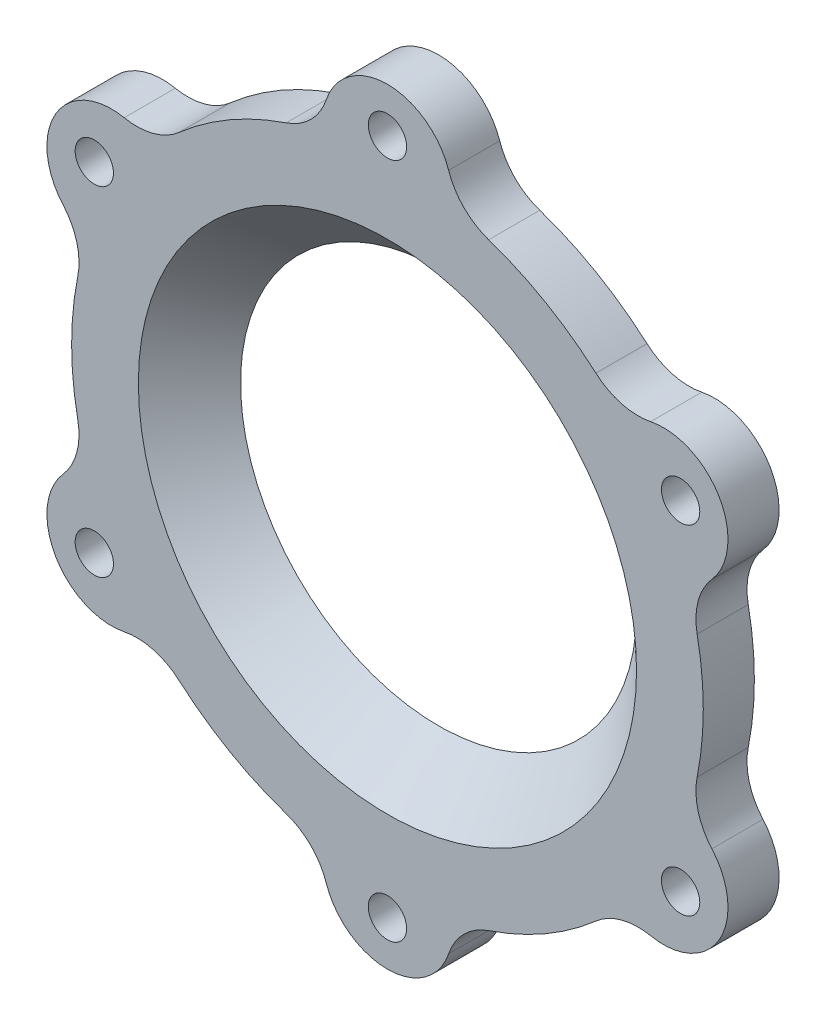
ISO-10303-21;
HEADER;
FILE_DESCRIPTION(('STEP AP214'),'2;1');
FILE_NAME('part.step','',(''),(''),'','','');
FILE_SCHEMA(('AUTOMOTIVE_DESIGN { 1 0 10303 214 1 1 1 1 }'));
ENDSEC;
DATA;
#1=APPLICATION_CONTEXT('core data for automotive mechanical design processes');
#2=APPLICATION_PROTOCOL_DEFINITION('international standard','automotive_design',2000,#1);
#3=PRODUCT_CONTEXT('',#1,'mechanical');
#4=PRODUCT('Part','Part','',(#3));
#5=PRODUCT_RELATED_PRODUCT_CATEGORY('part','',(#4));
#6=PRODUCT_DEFINITION_FORMATION('','',#4);
#7=PRODUCT_DEFINITION_CONTEXT('part definition',#1,'design');
#8=PRODUCT_DEFINITION('design','',#6,#7);
#9=PRODUCT_DEFINITION_SHAPE('','',#8);
#10=(LENGTH_UNIT() NAMED_UNIT(*) SI_UNIT(.MILLI.,.METRE.));
#11=(NAMED_UNIT(*) PLANE_ANGLE_UNIT() SI_UNIT($,.RADIAN.));
#12=(NAMED_UNIT(*) SI_UNIT($,.STERADIAN.) SOLID_ANGLE_UNIT());
#13=UNCERTAINTY_MEASURE_WITH_UNIT(LENGTH_MEASURE(1.E-05),#10,'distance_accuracy_value','');
#14=(GEOMETRIC_REPRESENTATION_CONTEXT(3) GLOBAL_UNCERTAINTY_ASSIGNED_CONTEXT((#13)) GLOBAL_UNIT_ASSIGNED_CONTEXT((#10,
#11,#12)) REPRESENTATION_CONTEXT('',''));
#15=CARTESIAN_POINT('',(0.,0.,0.));
#16=DIRECTION('',(0.,0.,1.));
#17=DIRECTION('',(1.,0.,0.));
#18=AXIS2_PLACEMENT_3D('',#15,#16,#17);
#19=CARTESIAN_POINT('',(0.,49.8932666526099,8.));
#20=DIRECTION('',(0.,0.,-1.));
#21=DIRECTION('',(-1.,0.,0.));
#22=AXIS2_PLACEMENT_3D('',#19,#20,#21);
#23=CYLINDRICAL_SURFACE('',#22,10.1067333473901);
#24=CARTESIAN_POINT('',(0.,49.8932666526099,0.));
#25=DIRECTION('',(0.,0.,1.));
#26=DIRECTION('',(1.,0.,0.));
#27=AXIS2_PLACEMENT_3D('',#24,#25,#26);
#28=CIRCLE('',#27,10.1067333473901);
#29=CARTESIAN_POINT('',(-9.57760471103616,53.120579304707,0.));
#30=VERTEX_POINT('',#29);
#31=CARTESIAN_POINT('',(9.57760471103616,53.120579304707,0.));
#32=VERTEX_POINT('',#31);
#33=EDGE_CURVE('E324',#30,#32,#28,.F.);
#34=ORIENTED_EDGE('',*,*,#33,.F.);
#35=DIRECTION('',(0.,0.,-1.));
#36=VECTOR('',#35,1.);
#37=CARTESIAN_POINT('',(-9.57760471103616,53.120579304707,8.));
#38=LINE('',#37,#36);
#39=CARTESIAN_POINT('',(-9.57760471103616,53.120579304707,8.));
#40=VERTEX_POINT('',#39);
#41=EDGE_CURVE('E58',#40,#30,#38,.T.);
#42=ORIENTED_EDGE('',*,*,#41,.F.);
#43=CARTESIAN_POINT('',(0.,49.8932666526099,8.));
#44=DIRECTION('',(0.,0.,1.));
#45=DIRECTION('',(1.,0.,0.));
#46=AXIS2_PLACEMENT_3D('',#43,#44,#45);
#47=CIRCLE('',#46,10.1067333473901);
#48=CARTESIAN_POINT('',(9.57760471103616,53.120579304707,8.));
#49=VERTEX_POINT('',#48);
#50=EDGE_CURVE('E478',#40,#49,#47,.F.);
#51=ORIENTED_EDGE('',*,*,#50,.T.);
#52=DIRECTION('',(0.,0.,-1.));
#53=VECTOR('',#52,1.);
#54=CARTESIAN_POINT('',(9.57760471103616,53.120579304707,8.));
#55=LINE('',#54,#53);
#56=EDGE_CURVE('E66',#49,#32,#55,.T.);
#57=ORIENTED_EDGE('',*,*,#56,.T.);
#58=EDGE_LOOP('',(#34,#42,#51,#57));
#59=FACE_BOUND('',#58,.T.);
#60=ADVANCED_FACE('F47',(#59),#23,.T.);
#61=CARTESIAN_POINT('',(-19.0540639999412,56.3138095415871,8.));
#62=DIRECTION('',(0.,0.,-1.));
#63=DIRECTION('',(-1.,0.,0.));
#64=AXIS2_PLACEMENT_3D('',#61,#62,#63);
#65=CYLINDRICAL_SURFACE('',#64,9.99999999999999);
#66=CARTESIAN_POINT('',(-19.0540639999412,56.3138095415871,0.));
#67=DIRECTION('',(0.,0.,1.));
#68=DIRECTION('',(1.,0.,0.));
#69=AXIS2_PLACEMENT_3D('',#66,#67,#68);
#70=CIRCLE('',#69,9.99999999999999);
#71=CARTESIAN_POINT('',(-15.8490069772429,46.8413436809333,0.));
#72=VERTEX_POINT('',#71);
#73=EDGE_CURVE('E317',#30,#72,#70,.F.);
#74=ORIENTED_EDGE('',*,*,#73,.T.);
#75=DIRECTION('',(0.,0.,-1.));
#76=VECTOR('',#75,1.);
#77=CARTESIAN_POINT('',(-15.8490069772429,46.8413436809333,8.));
#78=LINE('',#77,#76);
#79=CARTESIAN_POINT('',(-15.8490069772429,46.8413436809333,8.));
#80=VERTEX_POINT('',#79);
#81=EDGE_CURVE('E308',#80,#72,#78,.T.);
#82=ORIENTED_EDGE('',*,*,#81,.F.);
#83=CARTESIAN_POINT('',(-19.0540639999412,56.3138095415871,8.));
#84=DIRECTION('',(0.,0.,1.));
#85=DIRECTION('',(1.,0.,0.));
#86=AXIS2_PLACEMENT_3D('',#83,#84,#85);
#87=CIRCLE('',#86,9.99999999999999);
#88=EDGE_CURVE('E319',#40,#80,#87,.F.);
#89=ORIENTED_EDGE('',*,*,#88,.F.);
#90=ORIENTED_EDGE('',*,*,#41,.T.);
#91=EDGE_LOOP('',(#74,#82,#89,#90));
#92=FACE_BOUND('',#91,.T.);
#93=ADVANCED_FACE('F315',(#92),#65,.F.);
#94=CARTESIAN_POINT('',(0.,0.,8.));
#95=DIRECTION('',(0.,0.,-1.));
#96=DIRECTION('',(-1.,0.,0.));
#97=AXIS2_PLACEMENT_3D('',#94,#95,#96);
#98=CYLINDRICAL_SURFACE('',#97,49.45);
#99=CARTESIAN_POINT('',(0.,0.,0.));
#100=DIRECTION('',(0.,0.,1.));
#101=DIRECTION('',(1.,0.,0.));
#102=AXIS2_PLACEMENT_3D('',#99,#100,#101);
#103=CIRCLE('',#102,49.45);
#104=CARTESIAN_POINT('',(-32.6412900864638,37.1463145075139,0.));
#105=VERTEX_POINT('',#104);
#106=EDGE_CURVE('E327',#72,#105,#103,.T.);
#107=ORIENTED_EDGE('',*,*,#106,.T.);
#108=DIRECTION('',(0.,0.,-1.));
#109=VECTOR('',#108,1.);
#110=CARTESIAN_POINT('',(-32.6412900864638,37.1463145075139,8.));
#111=LINE('',#110,#109);
#112=CARTESIAN_POINT('',(-32.6412900864638,37.1463145075139,8.));
#113=VERTEX_POINT('',#112);
#114=EDGE_CURVE('E305',#113,#105,#111,.T.);
#115=ORIENTED_EDGE('',*,*,#114,.F.);
#116=CARTESIAN_POINT('',(0.,0.,8.));
#117=DIRECTION('',(0.,0.,1.));
#118=DIRECTION('',(1.,0.,0.));
#119=AXIS2_PLACEMENT_3D('',#116,#117,#118);
#120=CIRCLE('',#119,49.45);
#121=EDGE_CURVE('E226',#80,#113,#120,.T.);
#122=ORIENTED_EDGE('',*,*,#121,.F.);
#123=ORIENTED_EDGE('',*,*,#81,.T.);
#124=EDGE_LOOP('',(#107,#115,#122,#123));
#125=FACE_BOUND('',#124,.T.);
#126=ADVANCED_FACE('F457',(#125),#98,.T.);
#127=CARTESIAN_POINT('',(-39.2421576469201,44.6582082400733,8.));
#128=DIRECTION('',(0.,0.,-1.));
#129=DIRECTION('',(-1.,0.,0.));
#130=AXIS2_PLACEMENT_3D('',#127,#128,#129);
#131=CYLINDRICAL_SURFACE('',#130,9.99999999999999);
#132=CARTESIAN_POINT('',(-39.2421576469201,44.6582082400733,0.));
#133=DIRECTION('',(0.,0.,1.));
#134=DIRECTION('',(1.,0.,0.));
#135=AXIS2_PLACEMENT_3D('',#132,#133,#134);
#136=CIRCLE('',#135,9.99999999999999);
#137=CARTESIAN_POINT('',(-41.2149687861018,34.8547386395124,0.));
#138=VERTEX_POINT('',#137);
#139=EDGE_CURVE('E341',#138,#105,#136,.T.);
#140=ORIENTED_EDGE('',*,*,#139,.F.);
#141=DIRECTION('',(0.,0.,-1.));
#142=VECTOR('',#141,1.);
#143=CARTESIAN_POINT('',(-41.2149687861018,34.8547386395124,8.));
#144=LINE('',#143,#142);
#145=CARTESIAN_POINT('',(-41.2149687861018,34.8547386395124,8.));
#146=VERTEX_POINT('',#145);
#147=EDGE_CURVE('E302',#146,#138,#144,.T.);
#148=ORIENTED_EDGE('',*,*,#147,.F.);
#149=CARTESIAN_POINT('',(-39.2421576469201,44.6582082400733,8.));
#150=DIRECTION('',(0.,0.,1.));
#151=DIRECTION('',(1.,0.,0.));
#152=AXIS2_PLACEMENT_3D('',#149,#150,#151);
#153=CIRCLE('',#152,9.99999999999999);
#154=EDGE_CURVE('E486',#146,#113,#153,.T.);
#155=ORIENTED_EDGE('',*,*,#154,.T.);
#156=ORIENTED_EDGE('',*,*,#114,.T.);
#157=EDGE_LOOP('',(#140,#148,#155,#156));
#158=FACE_BOUND('',#157,.T.);
#159=ADVANCED_FACE('F645',(#158),#131,.F.);
#160=CARTESIAN_POINT('',(-43.2088363989489,24.946633326301,8.));
#161=DIRECTION('',(0.,0.,-1.));
#162=DIRECTION('',(-1.,0.,0.));
#163=AXIS2_PLACEMENT_3D('',#160,#161,#162);
#164=CYLINDRICAL_SURFACE('',#163,10.1067333473901);
#165=CARTESIAN_POINT('',(-43.2088363989489,24.946633326301,0.));
#166=DIRECTION('',(0.,0.,1.));
#167=DIRECTION('',(1.,0.,0.));
#168=AXIS2_PLACEMENT_3D('',#165,#166,#167);
#169=CIRCLE('',#168,10.1067333473901);
#170=CARTESIAN_POINT('',(-50.792573497138,18.2658406651867,0.));
#171=VERTEX_POINT('',#170);
#172=EDGE_CURVE('E346',#171,#138,#169,.F.);
#173=ORIENTED_EDGE('',*,*,#172,.F.);
#174=DIRECTION('',(0.,0.,-1.));
#175=VECTOR('',#174,1.);
#176=CARTESIAN_POINT('',(-50.792573497138,18.2658406651867,8.));
#177=LINE('',#176,#175);
#178=CARTESIAN_POINT('',(-50.792573497138,18.2658406651867,8.));
#179=VERTEX_POINT('',#178);
#180=EDGE_CURVE('E299',#179,#171,#177,.T.);
#181=ORIENTED_EDGE('',*,*,#180,.F.);
#182=CARTESIAN_POINT('',(-43.2088363989489,24.946633326301,8.));
#183=DIRECTION('',(0.,0.,1.));
#184=DIRECTION('',(1.,0.,0.));
#185=AXIS2_PLACEMENT_3D('',#182,#183,#184);
#186=CIRCLE('',#185,10.1067333473901);
#187=EDGE_CURVE('E491',#179,#146,#186,.F.);
#188=ORIENTED_EDGE('',*,*,#187,.T.);
#189=ORIENTED_EDGE('',*,*,#147,.T.);
#190=EDGE_LOOP('',(#173,#181,#188,#189));
#191=FACE_BOUND('',#190,.T.);
#192=ADVANCED_FACE('F642',(#191),#164,.T.);
#193=CARTESIAN_POINT('',(-58.2962216468613,11.655601301506,8.));
#194=DIRECTION('',(0.,0.,-1.));
#195=DIRECTION('',(-1.,0.,0.));
#196=AXIS2_PLACEMENT_3D('',#193,#194,#195);
#197=CYLINDRICAL_SURFACE('',#196,9.99999999999999);
#198=CARTESIAN_POINT('',(-58.2962216468613,11.655601301506,0.));
#199=DIRECTION('',(0.,0.,1.));
#200=DIRECTION('',(1.,0.,0.));
#201=AXIS2_PLACEMENT_3D('',#198,#199,#200);
#202=CIRCLE('',#201,9.99999999999999);
#203=CARTESIAN_POINT('',(-48.4902970637067,9.69502917341443,0.));
#204=VERTEX_POINT('',#203);
#205=EDGE_CURVE('E350',#171,#204,#202,.F.);
#206=ORIENTED_EDGE('',*,*,#205,.T.);
#207=DIRECTION('',(0.,0.,-1.));
#208=VECTOR('',#207,1.);
#209=CARTESIAN_POINT('',(-48.4902970637067,9.69502917341443,8.));
#210=LINE('',#209,#208);
#211=CARTESIAN_POINT('',(-48.4902970637067,9.69502917341443,8.));
#212=VERTEX_POINT('',#211);
#213=EDGE_CURVE('E295',#212,#204,#210,.T.);
#214=ORIENTED_EDGE('',*,*,#213,.F.);
#215=CARTESIAN_POINT('',(-58.2962216468613,11.655601301506,8.));
#216=DIRECTION('',(0.,0.,1.));
#217=DIRECTION('',(1.,0.,0.));
#218=AXIS2_PLACEMENT_3D('',#215,#216,#217);
#219=CIRCLE('',#218,9.99999999999999);
#220=EDGE_CURVE('E495',#179,#212,#219,.F.);
#221=ORIENTED_EDGE('',*,*,#220,.F.);
#222=ORIENTED_EDGE('',*,*,#180,.T.);
#223=EDGE_LOOP('',(#206,#214,#221,#222));
#224=FACE_BOUND('',#223,.T.);
#225=ADVANCED_FACE('F639',(#224),#197,.F.);
#226=CARTESIAN_POINT('',(-48.4902970637042,-9.69502917342115,0.));
#227=VERTEX_POINT('',#226);
#228=EDGE_CURVE('E343',#204,#227,#103,.T.);
#229=ORIENTED_EDGE('',*,*,#228,.T.);
#230=DIRECTION('',(0.,0.,-1.));
#231=VECTOR('',#230,1.);
#232=CARTESIAN_POINT('',(-48.4902970637042,-9.69502917342115,8.));
#233=LINE('',#232,#231);
#234=CARTESIAN_POINT('',(-48.4902970637042,-9.69502917342115,8.));
#235=VERTEX_POINT('',#234);
#236=EDGE_CURVE('E292',#235,#227,#233,.T.);
#237=ORIENTED_EDGE('',*,*,#236,.F.);
#238=EDGE_CURVE('E487',#212,#235,#120,.T.);
#239=ORIENTED_EDGE('',*,*,#238,.F.);
#240=ORIENTED_EDGE('',*,*,#213,.T.);
#241=EDGE_LOOP('',(#229,#237,#239,#240));
#242=FACE_BOUND('',#241,.T.);
#243=ADVANCED_FACE('F637',(#242),#98,.T.);
#244=CARTESIAN_POINT('',(-58.2962216468568,-11.6556013015138,8.));
#245=DIRECTION('',(0.,0.,-1.));
#246=DIRECTION('',(-1.,0.,0.));
#247=AXIS2_PLACEMENT_3D('',#244,#245,#246);
#248=CYLINDRICAL_SURFACE('',#247,10.);
#249=CARTESIAN_POINT('',(-58.2962216468568,-11.6556013015138,0.));
#250=DIRECTION('',(0.,0.,1.));
#251=DIRECTION('',(1.,0.,0.));
#252=AXIS2_PLACEMENT_3D('',#249,#250,#251);
#253=CIRCLE('',#252,10.);
#254=CARTESIAN_POINT('',(-50.7925734971335,-18.2658406651945,0.));
#255=VERTEX_POINT('',#254);
#256=EDGE_CURVE('E354',#255,#227,#253,.T.);
#257=ORIENTED_EDGE('',*,*,#256,.F.);
#258=DIRECTION('',(0.,0.,-1.));
#259=VECTOR('',#258,1.);
#260=CARTESIAN_POINT('',(-50.7925734971335,-18.2658406651945,8.));
#261=LINE('',#260,#259);
#262=CARTESIAN_POINT('',(-50.7925734971335,-18.2658406651945,8.));
#263=VERTEX_POINT('',#262);
#264=EDGE_CURVE('E289',#263,#255,#261,.T.);
#265=ORIENTED_EDGE('',*,*,#264,.F.);
#266=CARTESIAN_POINT('',(-58.2962216468568,-11.6556013015138,8.));
#267=DIRECTION('',(0.,0.,1.));
#268=DIRECTION('',(1.,0.,0.));
#269=AXIS2_PLACEMENT_3D('',#266,#267,#268);
#270=CIRCLE('',#269,10.);
#271=EDGE_CURVE('E499',#263,#235,#270,.T.);
#272=ORIENTED_EDGE('',*,*,#271,.T.);
#273=ORIENTED_EDGE('',*,*,#236,.T.);
#274=EDGE_LOOP('',(#257,#265,#272,#273));
#275=FACE_BOUND('',#274,.T.);
#276=ADVANCED_FACE('F633',(#275),#248,.F.);
#277=CARTESIAN_POINT('',(-43.2088363989444,-24.9466333263088,8.));
#278=DIRECTION('',(0.,0.,-1.));
#279=DIRECTION('',(-1.,0.,0.));
#280=AXIS2_PLACEMENT_3D('',#277,#278,#279);
#281=CYLINDRICAL_SURFACE('',#280,10.1067333473901);
#282=CARTESIAN_POINT('',(-43.2088363989444,-24.9466333263088,0.));
#283=DIRECTION('',(0.,0.,1.));
#284=DIRECTION('',(1.,0.,0.));
#285=AXIS2_PLACEMENT_3D('',#282,#283,#284);
#286=CIRCLE('',#285,10.1067333473901);
#287=CARTESIAN_POINT('',(-41.2149687860973,-34.8547386395202,0.));
#288=VERTEX_POINT('',#287);
#289=EDGE_CURVE('E358',#288,#255,#286,.F.);
#290=ORIENTED_EDGE('',*,*,#289,.F.);
#291=DIRECTION('',(0.,0.,-1.));
#292=VECTOR('',#291,1.);
#293=CARTESIAN_POINT('',(-41.2149687860973,-34.8547386395202,8.));
#294=LINE('',#293,#292);
#295=CARTESIAN_POINT('',(-41.2149687860973,-34.8547386395202,8.));
#296=VERTEX_POINT('',#295);
#297=EDGE_CURVE('E286',#296,#288,#294,.T.);
#298=ORIENTED_EDGE('',*,*,#297,.F.);
#299=CARTESIAN_POINT('',(-43.2088363989444,-24.9466333263088,8.));
#300=DIRECTION('',(0.,0.,1.));
#301=DIRECTION('',(1.,0.,0.));
#302=AXIS2_PLACEMENT_3D('',#299,#300,#301);
#303=CIRCLE('',#302,10.1067333473901);
#304=EDGE_CURVE('E503',#296,#263,#303,.F.);
#305=ORIENTED_EDGE('',*,*,#304,.T.);
#306=ORIENTED_EDGE('',*,*,#264,.T.);
#307=EDGE_LOOP('',(#290,#298,#305,#306));
#308=FACE_BOUND('',#307,.T.);
#309=ADVANCED_FACE('F629',(#308),#281,.T.);
#310=CARTESIAN_POINT('',(-39.2421576469156,-44.658208240081,8.));
#311=DIRECTION('',(0.,0.,-1.));
#312=DIRECTION('',(-1.,0.,0.));
#313=AXIS2_PLACEMENT_3D('',#310,#311,#312);
#314=CYLINDRICAL_SURFACE('',#313,9.99999999999999);
#315=CARTESIAN_POINT('',(-39.2421576469156,-44.658208240081,0.));
#316=DIRECTION('',(0.,0.,1.));
#317=DIRECTION('',(1.,0.,0.));
#318=AXIS2_PLACEMENT_3D('',#315,#316,#317);
#319=CIRCLE('',#318,9.99999999999999);
#320=CARTESIAN_POINT('',(-32.6412900864593,-37.1463145075195,0.));
#321=VERTEX_POINT('',#320);
#322=EDGE_CURVE('E362',#288,#321,#319,.F.);
#323=ORIENTED_EDGE('',*,*,#322,.T.);
#324=DIRECTION('',(0.,0.,-1.));
#325=VECTOR('',#324,1.);
#326=CARTESIAN_POINT('',(-32.6412900864593,-37.1463145075195,8.));
#327=LINE('',#326,#325);
#328=CARTESIAN_POINT('',(-32.6412900864593,-37.1463145075195,8.));
#329=VERTEX_POINT('',#328);
#330=EDGE_CURVE('E282',#329,#321,#327,.T.);
#331=ORIENTED_EDGE('',*,*,#330,.F.);
#332=CARTESIAN_POINT('',(-39.2421576469156,-44.658208240081,8.));
#333=DIRECTION('',(0.,0.,1.));
#334=DIRECTION('',(1.,0.,0.));
#335=AXIS2_PLACEMENT_3D('',#332,#333,#334);
#336=CIRCLE('',#335,9.99999999999999);
#337=EDGE_CURVE('E507',#296,#329,#336,.F.);
#338=ORIENTED_EDGE('',*,*,#337,.F.);
#339=ORIENTED_EDGE('',*,*,#297,.T.);
#340=EDGE_LOOP('',(#323,#331,#338,#339));
#341=FACE_BOUND('',#340,.T.);
#342=ADVANCED_FACE('F626',(#341),#314,.F.);
#343=CARTESIAN_POINT('',(-15.8490069772359,-46.8413436809344,0.));
#344=VERTEX_POINT('',#343);
#345=EDGE_CURVE('E366',#321,#344,#103,.T.);
#346=ORIENTED_EDGE('',*,*,#345,.T.);
#347=DIRECTION('',(0.,0.,-1.));
#348=VECTOR('',#347,1.);
#349=CARTESIAN_POINT('',(-15.8490069772359,-46.8413436809344,8.));
#350=LINE('',#349,#348);
#351=CARTESIAN_POINT('',(-15.8490069772359,-46.8413436809344,8.));
#352=VERTEX_POINT('',#351);
#353=EDGE_CURVE('E279',#352,#344,#350,.T.);
#354=ORIENTED_EDGE('',*,*,#353,.F.);
#355=EDGE_CURVE('E511',#329,#352,#120,.T.);
#356=ORIENTED_EDGE('',*,*,#355,.F.);
#357=ORIENTED_EDGE('',*,*,#330,.T.);
#358=EDGE_LOOP('',(#346,#354,#356,#357));
#359=FACE_BOUND('',#358,.T.);
#360=ADVANCED_FACE('F624',(#359),#98,.T.);
#361=CARTESIAN_POINT('',(-19.0540639999322,-56.3138095415871,8.));
#362=DIRECTION('',(0.,0.,-1.));
#363=DIRECTION('',(-1.,0.,0.));
#364=AXIS2_PLACEMENT_3D('',#361,#362,#363);
#365=CYLINDRICAL_SURFACE('',#364,9.99999999999999);
#366=CARTESIAN_POINT('',(-19.0540639999322,-56.3138095415871,0.));
#367=DIRECTION('',(0.,0.,1.));
#368=DIRECTION('',(1.,0.,0.));
#369=AXIS2_PLACEMENT_3D('',#366,#367,#368);
#370=CIRCLE('',#369,9.99999999999999);
#371=CARTESIAN_POINT('',(-9.57760471102722,-53.120579304707,0.));
#372=VERTEX_POINT('',#371);
#373=EDGE_CURVE('E367',#372,#344,#370,.T.);
#374=ORIENTED_EDGE('',*,*,#373,.F.);
#375=DIRECTION('',(0.,0.,-1.));
#376=VECTOR('',#375,1.);
#377=CARTESIAN_POINT('',(-9.57760471102722,-53.120579304707,8.));
#378=LINE('',#377,#376);
#379=CARTESIAN_POINT('',(-9.57760471102722,-53.120579304707,8.));
#380=VERTEX_POINT('',#379);
#381=EDGE_CURVE('E276',#380,#372,#378,.T.);
#382=ORIENTED_EDGE('',*,*,#381,.F.);
#383=CARTESIAN_POINT('',(-19.0540639999322,-56.3138095415871,8.));
#384=DIRECTION('',(0.,0.,1.));
#385=DIRECTION('',(1.,0.,0.));
#386=AXIS2_PLACEMENT_3D('',#383,#384,#385);
#387=CIRCLE('',#386,9.99999999999999);
#388=EDGE_CURVE('E512',#380,#352,#387,.T.);
#389=ORIENTED_EDGE('',*,*,#388,.T.);
#390=ORIENTED_EDGE('',*,*,#353,.T.);
#391=EDGE_LOOP('',(#374,#382,#389,#390));
#392=FACE_BOUND('',#391,.T.);
#393=ADVANCED_FACE('F620',(#392),#365,.F.);
#394=CARTESIAN_POINT('',(8.93523674613358E-12,-49.8932666526099,8.));
#395=DIRECTION('',(0.,0.,-1.));
#396=DIRECTION('',(-1.,0.,0.));
#397=AXIS2_PLACEMENT_3D('',#394,#395,#396);
#398=CYLINDRICAL_SURFACE('',#397,10.1067333473901);
#399=CARTESIAN_POINT('',(8.93523674613358E-12,-49.8932666526099,0.));
#400=DIRECTION('',(0.,0.,1.));
#401=DIRECTION('',(1.,0.,0.));
#402=AXIS2_PLACEMENT_3D('',#399,#400,#401);
#403=CIRCLE('',#402,10.1067333473901);
#404=CARTESIAN_POINT('',(9.57760471104509,-53.120579304707,0.));
#405=VERTEX_POINT('',#404);
#406=EDGE_CURVE('E371',#405,#372,#403,.F.);
#407=ORIENTED_EDGE('',*,*,#406,.F.);
#408=DIRECTION('',(0.,0.,-1.));
#409=VECTOR('',#408,1.);
#410=CARTESIAN_POINT('',(9.57760471104509,-53.120579304707,8.));
#411=LINE('',#410,#409);
#412=CARTESIAN_POINT('',(9.57760471104509,-53.120579304707,8.));
#413=VERTEX_POINT('',#412);
#414=EDGE_CURVE('E273',#413,#405,#411,.T.);
#415=ORIENTED_EDGE('',*,*,#414,.F.);
#416=CARTESIAN_POINT('',(8.93523674613358E-12,-49.8932666526099,8.));
#417=DIRECTION('',(0.,0.,1.));
#418=DIRECTION('',(1.,0.,0.));
#419=AXIS2_PLACEMENT_3D('',#416,#417,#418);
#420=CIRCLE('',#419,10.1067333473901);
#421=EDGE_CURVE('E516',#413,#380,#420,.F.);
#422=ORIENTED_EDGE('',*,*,#421,.T.);
#423=ORIENTED_EDGE('',*,*,#381,.T.);
#424=EDGE_LOOP('',(#407,#415,#422,#423));
#425=FACE_BOUND('',#424,.T.);
#426=ADVANCED_FACE('F616',(#425),#398,.T.);
#427=CARTESIAN_POINT('',(19.0540639999501,-56.3138095415871,8.));
#428=DIRECTION('',(0.,0.,-1.));
#429=DIRECTION('',(-1.,0.,0.));
#430=AXIS2_PLACEMENT_3D('',#427,#428,#429);
#431=CYLINDRICAL_SURFACE('',#430,9.99999999999999);
#432=CARTESIAN_POINT('',(19.0540639999501,-56.3138095415871,0.));
#433=DIRECTION('',(0.,0.,1.));
#434=DIRECTION('',(1.,0.,0.));
#435=AXIS2_PLACEMENT_3D('',#432,#433,#434);
#436=CIRCLE('',#435,9.99999999999999);
#437=CARTESIAN_POINT('',(15.84900697725,-46.8413436809321,0.));
#438=VERTEX_POINT('',#437);
#439=EDGE_CURVE('E375',#405,#438,#436,.F.);
#440=ORIENTED_EDGE('',*,*,#439,.T.);
#441=DIRECTION('',(0.,0.,-1.));
#442=VECTOR('',#441,1.);
#443=CARTESIAN_POINT('',(15.84900697725,-46.8413436809321,8.));
#444=LINE('',#443,#442);
#445=CARTESIAN_POINT('',(15.84900697725,-46.8413436809321,8.));
#446=VERTEX_POINT('',#445);
#447=EDGE_CURVE('E269',#446,#438,#444,.T.);
#448=ORIENTED_EDGE('',*,*,#447,.F.);
#449=CARTESIAN_POINT('',(19.0540639999501,-56.3138095415871,8.));
#450=DIRECTION('',(0.,0.,1.));
#451=DIRECTION('',(1.,0.,0.));
#452=AXIS2_PLACEMENT_3D('',#449,#450,#451);
#453=CIRCLE('',#452,9.99999999999999);
#454=EDGE_CURVE('E520',#413,#446,#453,.F.);
#455=ORIENTED_EDGE('',*,*,#454,.F.);
#456=ORIENTED_EDGE('',*,*,#414,.T.);
#457=EDGE_LOOP('',(#440,#448,#455,#456));
#458=FACE_BOUND('',#457,.T.);
#459=ADVANCED_FACE('F613',(#458),#431,.F.);
#460=CARTESIAN_POINT('',(32.6412900864696,-37.1463145075121,0.));
#461=VERTEX_POINT('',#460);
#462=EDGE_CURVE('E379',#438,#461,#103,.T.);
#463=ORIENTED_EDGE('',*,*,#462,.T.);
#464=DIRECTION('',(0.,0.,-1.));
#465=VECTOR('',#464,1.);
#466=CARTESIAN_POINT('',(32.6412900864696,-37.1463145075121,8.));
#467=LINE('',#466,#465);
#468=CARTESIAN_POINT('',(32.6412900864696,-37.1463145075121,8.));
#469=VERTEX_POINT('',#468);
#470=EDGE_CURVE('E266',#469,#461,#467,.T.);
#471=ORIENTED_EDGE('',*,*,#470,.F.);
#472=EDGE_CURVE('E524',#446,#469,#120,.T.);
#473=ORIENTED_EDGE('',*,*,#472,.F.);
#474=ORIENTED_EDGE('',*,*,#447,.T.);
#475=EDGE_LOOP('',(#463,#471,#473,#474));
#476=FACE_BOUND('',#475,.T.);
#477=ADVANCED_FACE('F611',(#476),#98,.T.);
#478=CARTESIAN_POINT('',(39.2421576469291,-44.6582082400733,8.));
#479=DIRECTION('',(0.,0.,-1.));
#480=DIRECTION('',(-1.,0.,0.));
#481=AXIS2_PLACEMENT_3D('',#478,#479,#480);
#482=CYLINDRICAL_SURFACE('',#481,9.99999999999999);
#483=CARTESIAN_POINT('',(39.2421576469291,-44.6582082400733,0.));
#484=DIRECTION('',(0.,0.,1.));
#485=DIRECTION('',(1.,0.,0.));
#486=AXIS2_PLACEMENT_3D('',#483,#484,#485);
#487=CIRCLE('',#486,9.99999999999999);
#488=CARTESIAN_POINT('',(41.2149687861108,-34.8547386395124,0.));
#489=VERTEX_POINT('',#488);
#490=EDGE_CURVE('E380',#489,#461,#487,.T.);
#491=ORIENTED_EDGE('',*,*,#490,.F.);
#492=DIRECTION('',(0.,0.,-1.));
#493=VECTOR('',#492,1.);
#494=CARTESIAN_POINT('',(41.2149687861108,-34.8547386395124,8.));
#495=LINE('',#494,#493);
#496=CARTESIAN_POINT('',(41.2149687861108,-34.8547386395124,8.));
#497=VERTEX_POINT('',#496);
#498=EDGE_CURVE('E263',#497,#489,#495,.T.);
#499=ORIENTED_EDGE('',*,*,#498,.F.);
#500=CARTESIAN_POINT('',(39.2421576469291,-44.6582082400733,8.));
#501=DIRECTION('',(0.,0.,1.));
#502=DIRECTION('',(1.,0.,0.));
#503=AXIS2_PLACEMENT_3D('',#500,#501,#502);
#504=CIRCLE('',#503,9.99999999999999);
#505=EDGE_CURVE('E525',#497,#469,#504,.T.);
#506=ORIENTED_EDGE('',*,*,#505,.T.);
#507=ORIENTED_EDGE('',*,*,#470,.T.);
#508=EDGE_LOOP('',(#491,#499,#506,#507));
#509=FACE_BOUND('',#508,.T.);
#510=ADVANCED_FACE('F607',(#509),#482,.F.);
#511=CARTESIAN_POINT('',(43.2088363989578,-24.9466333263011,8.));
#512=DIRECTION('',(0.,0.,-1.));
#513=DIRECTION('',(-1.,0.,0.));
#514=AXIS2_PLACEMENT_3D('',#511,#512,#513);
#515=CYLINDRICAL_SURFACE('',#514,10.1067333473901);
#516=CARTESIAN_POINT('',(43.2088363989578,-24.9466333263011,0.));
#517=DIRECTION('',(0.,0.,1.));
#518=DIRECTION('',(1.,0.,0.));
#519=AXIS2_PLACEMENT_3D('',#516,#517,#518);
#520=CIRCLE('',#519,10.1067333473901);
#521=CARTESIAN_POINT('',(50.7925734971469,-18.2658406651868,0.));
#522=VERTEX_POINT('',#521);
#523=EDGE_CURVE('E384',#522,#489,#520,.F.);
#524=ORIENTED_EDGE('',*,*,#523,.F.);
#525=DIRECTION('',(0.,0.,-1.));
#526=VECTOR('',#525,1.);
#527=CARTESIAN_POINT('',(50.7925734971469,-18.2658406651868,8.));
#528=LINE('',#527,#526);
#529=CARTESIAN_POINT('',(50.7925734971469,-18.2658406651868,8.));
#530=VERTEX_POINT('',#529);
#531=EDGE_CURVE('E260',#530,#522,#528,.T.);
#532=ORIENTED_EDGE('',*,*,#531,.F.);
#533=CARTESIAN_POINT('',(43.2088363989578,-24.9466333263011,8.));
#534=DIRECTION('',(0.,0.,1.));
#535=DIRECTION('',(1.,0.,0.));
#536=AXIS2_PLACEMENT_3D('',#533,#534,#535);
#537=CIRCLE('',#536,10.1067333473901);
#538=EDGE_CURVE('E529',#530,#497,#537,.F.);
#539=ORIENTED_EDGE('',*,*,#538,.T.);
#540=ORIENTED_EDGE('',*,*,#498,.T.);
#541=EDGE_LOOP('',(#524,#532,#539,#540));
#542=FACE_BOUND('',#541,.T.);
#543=ADVANCED_FACE('F603',(#542),#515,.T.);
#544=CARTESIAN_POINT('',(58.2962216468702,-11.6556013015061,8.));
#545=DIRECTION('',(0.,0.,-1.));
#546=DIRECTION('',(-1.,0.,0.));
#547=AXIS2_PLACEMENT_3D('',#544,#545,#546);
#548=CYLINDRICAL_SURFACE('',#547,9.99999999999999);
#549=CARTESIAN_POINT('',(58.2962216468702,-11.6556013015061,0.));
#550=DIRECTION('',(0.,0.,1.));
#551=DIRECTION('',(1.,0.,0.));
#552=AXIS2_PLACEMENT_3D('',#549,#550,#551);
#553=CIRCLE('',#552,9.99999999999999);
#554=CARTESIAN_POINT('',(48.4902970637106,-9.69502917341374,0.));
#555=VERTEX_POINT('',#554);
#556=EDGE_CURVE('E388',#522,#555,#553,.F.);
#557=ORIENTED_EDGE('',*,*,#556,.T.);
#558=DIRECTION('',(0.,0.,-1.));
#559=VECTOR('',#558,1.);
#560=CARTESIAN_POINT('',(48.4902970637106,-9.69502917341374,8.));
#561=LINE('',#560,#559);
#562=CARTESIAN_POINT('',(48.4902970637106,-9.69502917341374,8.));
#563=VERTEX_POINT('',#562);
#564=EDGE_CURVE('E256',#563,#555,#561,.T.);
#565=ORIENTED_EDGE('',*,*,#564,.F.);
#566=CARTESIAN_POINT('',(58.2962216468702,-11.6556013015061,8.));
#567=DIRECTION('',(0.,0.,1.));
#568=DIRECTION('',(1.,0.,0.));
#569=AXIS2_PLACEMENT_3D('',#566,#567,#568);
#570=CIRCLE('',#569,9.99999999999999);
#571=EDGE_CURVE('E533',#530,#563,#570,.F.);
#572=ORIENTED_EDGE('',*,*,#571,.F.);
#573=ORIENTED_EDGE('',*,*,#531,.T.);
#574=EDGE_LOOP('',(#557,#565,#572,#573));
#575=FACE_BOUND('',#574,.T.);
#576=ADVANCED_FACE('F600',(#575),#548,.F.);
#577=CARTESIAN_POINT('',(48.490297063708,9.69502917342044,0.));
#578=VERTEX_POINT('',#577);
#579=EDGE_CURVE('E392',#555,#578,#103,.T.);
#580=ORIENTED_EDGE('',*,*,#579,.T.);
#581=DIRECTION('',(0.,0.,-1.));
#582=VECTOR('',#581,1.);
#583=CARTESIAN_POINT('',(48.490297063708,9.69502917342044,8.));
#584=LINE('',#583,#582);
#585=CARTESIAN_POINT('',(48.490297063708,9.69502917342044,8.));
#586=VERTEX_POINT('',#585);
#587=EDGE_CURVE('E253',#586,#578,#584,.T.);
#588=ORIENTED_EDGE('',*,*,#587,.F.);
#589=EDGE_CURVE('E225',#563,#586,#120,.T.);
#590=ORIENTED_EDGE('',*,*,#589,.F.);
#591=ORIENTED_EDGE('',*,*,#564,.T.);
#592=EDGE_LOOP('',(#580,#588,#590,#591));
#593=FACE_BOUND('',#592,.T.);
#594=ADVANCED_FACE('F582',(#593),#98,.T.);
#595=CARTESIAN_POINT('',(58.2962216468658,11.6556013015138,8.));
#596=DIRECTION('',(0.,0.,-1.));
#597=DIRECTION('',(-1.,0.,0.));
#598=AXIS2_PLACEMENT_3D('',#595,#596,#597);
#599=CYLINDRICAL_SURFACE('',#598,9.99999999999998);
#600=CARTESIAN_POINT('',(58.2962216468658,11.6556013015138,0.));
#601=DIRECTION('',(0.,0.,1.));
#602=DIRECTION('',(1.,0.,0.));
#603=AXIS2_PLACEMENT_3D('',#600,#601,#602);
#604=CIRCLE('',#603,9.99999999999998);
#605=CARTESIAN_POINT('',(50.7925734971424,18.2658406651945,0.));
#606=VERTEX_POINT('',#605);
#607=EDGE_CURVE('E393',#606,#578,#604,.T.);
#608=ORIENTED_EDGE('',*,*,#607,.F.);
#609=DIRECTION('',(0.,0.,-1.));
#610=VECTOR('',#609,1.);
#611=CARTESIAN_POINT('',(50.7925734971424,18.2658406651945,8.));
#612=LINE('',#611,#610);
#613=CARTESIAN_POINT('',(50.7925734971424,18.2658406651945,8.));
#614=VERTEX_POINT('',#613);
#615=EDGE_CURVE('E246',#614,#606,#612,.T.);
#616=ORIENTED_EDGE('',*,*,#615,.F.);
#617=CARTESIAN_POINT('',(58.2962216468658,11.6556013015138,8.));
#618=DIRECTION('',(0.,0.,1.));
#619=DIRECTION('',(1.,0.,0.));
#620=AXIS2_PLACEMENT_3D('',#617,#618,#619);
#621=CIRCLE('',#620,9.99999999999998);
#622=EDGE_CURVE('E537',#614,#586,#621,.T.);
#623=ORIENTED_EDGE('',*,*,#622,.T.);
#624=ORIENTED_EDGE('',*,*,#587,.T.);
#625=EDGE_LOOP('',(#608,#616,#623,#624));
#626=FACE_BOUND('',#625,.T.);
#627=ADVANCED_FACE('F595',(#626),#599,.F.);
#628=CARTESIAN_POINT('',(43.2088363989533,24.9466333263088,8.));
#629=DIRECTION('',(0.,0.,-1.));
#630=DIRECTION('',(-1.,0.,0.));
#631=AXIS2_PLACEMENT_3D('',#628,#629,#630);
#632=CYLINDRICAL_SURFACE('',#631,10.1067333473901);
#633=CARTESIAN_POINT('',(43.2088363989533,24.9466333263088,0.));
#634=DIRECTION('',(0.,0.,1.));
#635=DIRECTION('',(1.,0.,0.));
#636=AXIS2_PLACEMENT_3D('',#633,#634,#635);
#637=CIRCLE('',#636,10.1067333473901);
#638=CARTESIAN_POINT('',(41.2149687861063,34.8547386395202,0.));
#639=VERTEX_POINT('',#638);
#640=EDGE_CURVE('E397',#639,#606,#637,.F.);
#641=ORIENTED_EDGE('',*,*,#640,.F.);
#642=DIRECTION('',(0.,0.,-1.));
#643=VECTOR('',#642,1.);
#644=CARTESIAN_POINT('',(41.2149687861063,34.8547386395202,8.));
#645=LINE('',#644,#643);
#646=CARTESIAN_POINT('',(41.2149687861063,34.8547386395202,8.));
#647=VERTEX_POINT('',#646);
#648=EDGE_CURVE('E242',#647,#639,#645,.T.);
#649=ORIENTED_EDGE('',*,*,#648,.F.);
#650=CARTESIAN_POINT('',(43.2088363989533,24.9466333263088,8.));
#651=DIRECTION('',(0.,0.,1.));
#652=DIRECTION('',(1.,0.,0.));
#653=AXIS2_PLACEMENT_3D('',#650,#651,#652);
#654=CIRCLE('',#653,10.1067333473901);
#655=EDGE_CURVE('E234',#647,#614,#654,.F.);
#656=ORIENTED_EDGE('',*,*,#655,.T.);
#657=ORIENTED_EDGE('',*,*,#615,.T.);
#658=EDGE_LOOP('',(#641,#649,#656,#657));
#659=FACE_BOUND('',#658,.T.);
#660=ADVANCED_FACE('F592',(#659),#632,.T.);
#661=CARTESIAN_POINT('',(39.2421576469246,44.658208240081,8.));
#662=DIRECTION('',(0.,0.,-1.));
#663=DIRECTION('',(-1.,0.,0.));
#664=AXIS2_PLACEMENT_3D('',#661,#662,#663);
#665=CYLINDRICAL_SURFACE('',#664,10.);
#666=CARTESIAN_POINT('',(39.2421576469246,44.658208240081,0.));
#667=DIRECTION('',(0.,0.,1.));
#668=DIRECTION('',(1.,0.,0.));
#669=AXIS2_PLACEMENT_3D('',#666,#667,#668);
#670=CIRCLE('',#669,10.);
#671=CARTESIAN_POINT('',(32.6412900864651,37.1463145075177,0.));
#672=VERTEX_POINT('',#671);
#673=EDGE_CURVE('E240',#639,#672,#670,.F.);
#674=ORIENTED_EDGE('',*,*,#673,.T.);
#675=DIRECTION('',(0.,0.,-1.));
#676=VECTOR('',#675,1.);
#677=CARTESIAN_POINT('',(32.6412900864651,37.1463145075177,8.));
#678=LINE('',#677,#676);
#679=CARTESIAN_POINT('',(32.6412900864651,37.1463145075177,8.));
#680=VERTEX_POINT('',#679);
#681=EDGE_CURVE('E217',#680,#672,#678,.T.);
#682=ORIENTED_EDGE('',*,*,#681,.F.);
#683=CARTESIAN_POINT('',(39.2421576469246,44.658208240081,8.));
#684=DIRECTION('',(0.,0.,1.));
#685=DIRECTION('',(1.,0.,0.));
#686=AXIS2_PLACEMENT_3D('',#683,#684,#685);
#687=CIRCLE('',#686,10.);
#688=EDGE_CURVE('E223',#647,#680,#687,.F.);
#689=ORIENTED_EDGE('',*,*,#688,.F.);
#690=ORIENTED_EDGE('',*,*,#648,.T.);
#691=EDGE_LOOP('',(#674,#682,#689,#690));
#692=FACE_BOUND('',#691,.T.);
#693=ADVANCED_FACE('F238',(#692),#665,.F.);
#694=CARTESIAN_POINT('',(15.8490069772429,46.8413436809333,0.));
#695=VERTEX_POINT('',#694);
#696=EDGE_CURVE('E342',#672,#695,#103,.T.);
#697=ORIENTED_EDGE('',*,*,#696,.T.);
#698=DIRECTION('',(0.,0.,-1.));
#699=VECTOR('',#698,1.);
#700=CARTESIAN_POINT('',(15.8490069772429,46.8413436809333,8.));
#701=LINE('',#700,#699);
#702=CARTESIAN_POINT('',(15.8490069772429,46.8413436809333,8.));
#703=VERTEX_POINT('',#702);
#704=EDGE_CURVE('E141',#703,#695,#701,.T.);
#705=ORIENTED_EDGE('',*,*,#704,.F.);
#706=EDGE_CURVE('E213',#680,#703,#120,.T.);
#707=ORIENTED_EDGE('',*,*,#706,.F.);
#708=ORIENTED_EDGE('',*,*,#681,.T.);
#709=EDGE_LOOP('',(#697,#705,#707,#708));
#710=FACE_BOUND('',#709,.T.);
#711=ADVANCED_FACE('F215',(#710),#98,.T.);
#712=CARTESIAN_POINT('',(-45.8993464005752,-26.5,8.));
#713=DIRECTION('',(0.,0.,-1.));
#714=DIRECTION('',(-1.,0.,0.));
#715=AXIS2_PLACEMENT_3D('',#712,#713,#714);
#716=CYLINDRICAL_SURFACE('',#715,3.00000000000257);
#717=CARTESIAN_POINT('',(-45.8993464005752,-26.5,8.));
#718=DIRECTION('',(0.,0.,1.));
#719=DIRECTION('',(1.,0.,0.));
#720=AXIS2_PLACEMENT_3D('',#717,#718,#719);
#721=CIRCLE('',#720,3.00000000000257);
#722=CARTESIAN_POINT('',(-42.8993464005727,-26.5,8.));
#723=VERTEX_POINT('',#722);
#724=EDGE_CURVE('E430',#723,#723,#721,.T.);
#725=ORIENTED_EDGE('',*,*,#724,.T.);
#726=EDGE_LOOP('',(#725));
#727=FACE_BOUND('',#726,.T.);
#728=CARTESIAN_POINT('',(-45.8993464005752,-26.5,0.));
#729=DIRECTION('',(0.,0.,1.));
#730=DIRECTION('',(1.,0.,0.));
#731=AXIS2_PLACEMENT_3D('',#728,#729,#730);
#732=CIRCLE('',#731,3.00000000000257);
#733=CARTESIAN_POINT('',(-42.8993464005727,-26.5,0.));
#734=VERTEX_POINT('',#733);
#735=EDGE_CURVE('E418',#734,#734,#732,.T.);
#736=ORIENTED_EDGE('',*,*,#735,.F.);
#737=EDGE_LOOP('',(#736));
#738=FACE_BOUND('',#737,.T.);
#739=ADVANCED_FACE('F566',(#727,#738),#716,.F.);
#740=CARTESIAN_POINT('',(0.,-53.,8.));
#741=DIRECTION('',(0.,0.,-1.));
#742=DIRECTION('',(-1.,0.,0.));
#743=AXIS2_PLACEMENT_3D('',#740,#741,#742);
#744=CYLINDRICAL_SURFACE('',#743,3.00000000001087);
#745=CARTESIAN_POINT('',(0.,-53.,8.));
#746=DIRECTION('',(0.,0.,1.));
#747=DIRECTION('',(1.,0.,0.));
#748=AXIS2_PLACEMENT_3D('',#745,#746,#747);
#749=CIRCLE('',#748,3.00000000001087);
#750=CARTESIAN_POINT('',(3.00000000001088,-53.,8.));
#751=VERTEX_POINT('',#750);
#752=EDGE_CURVE('E436',#751,#751,#749,.T.);
#753=ORIENTED_EDGE('',*,*,#752,.T.);
#754=EDGE_LOOP('',(#753));
#755=FACE_BOUND('',#754,.T.);
#756=CARTESIAN_POINT('',(0.,-53.,0.));
#757=DIRECTION('',(0.,0.,1.));
#758=DIRECTION('',(1.,0.,0.));
#759=AXIS2_PLACEMENT_3D('',#756,#757,#758);
#760=CIRCLE('',#759,3.00000000001087);
#761=CARTESIAN_POINT('',(3.00000000001088,-53.,0.));
#762=VERTEX_POINT('',#761);
#763=EDGE_CURVE('E414',#762,#762,#760,.T.);
#764=ORIENTED_EDGE('',*,*,#763,.F.);
#765=EDGE_LOOP('',(#764));
#766=FACE_BOUND('',#765,.T.);
#767=ADVANCED_FACE('F556',(#755,#766),#744,.F.);
#768=CARTESIAN_POINT('',(45.8993464005753,-26.5,8.));
#769=DIRECTION('',(0.,0.,-1.));
#770=DIRECTION('',(-1.,0.,0.));
#771=AXIS2_PLACEMENT_3D('',#768,#769,#770);
#772=CYLINDRICAL_SURFACE('',#771,3.00000000000831);
#773=CARTESIAN_POINT('',(45.8993464005753,-26.5,8.));
#774=DIRECTION('',(0.,0.,1.));
#775=DIRECTION('',(1.,0.,0.));
#776=AXIS2_PLACEMENT_3D('',#773,#774,#775);
#777=CIRCLE('',#776,3.00000000000831);
#778=CARTESIAN_POINT('',(48.8993464005836,-26.5,8.));
#779=VERTEX_POINT('',#778);
#780=EDGE_CURVE('E549',#779,#779,#777,.T.);
#781=ORIENTED_EDGE('',*,*,#780,.T.);
#782=EDGE_LOOP('',(#781));
#783=FACE_BOUND('',#782,.T.);
#784=CARTESIAN_POINT('',(45.8993464005753,-26.5,0.));
#785=DIRECTION('',(0.,0.,1.));
#786=DIRECTION('',(1.,0.,0.));
#787=AXIS2_PLACEMENT_3D('',#784,#785,#786);
#788=CIRCLE('',#787,3.00000000000831);
#789=CARTESIAN_POINT('',(48.8993464005836,-26.5,0.));
#790=VERTEX_POINT('',#789);
#791=EDGE_CURVE('E410',#790,#790,#788,.T.);
#792=ORIENTED_EDGE('',*,*,#791,.F.);
#793=EDGE_LOOP('',(#792));
#794=FACE_BOUND('',#793,.T.);
#795=ADVANCED_FACE('F579',(#783,#794),#772,.F.);
#796=CARTESIAN_POINT('',(45.8993464005752,26.5,8.));
#797=DIRECTION('',(0.,0.,-1.));
#798=DIRECTION('',(-1.,0.,0.));
#799=AXIS2_PLACEMENT_3D('',#796,#797,#798);
#800=CYLINDRICAL_SURFACE('',#799,2.99999999999744);
#801=CARTESIAN_POINT('',(45.8993464005752,26.5,8.));
#802=DIRECTION('',(0.,0.,1.));
#803=DIRECTION('',(1.,0.,0.));
#804=AXIS2_PLACEMENT_3D('',#801,#802,#803);
#805=CIRCLE('',#804,2.99999999999744);
#806=CARTESIAN_POINT('',(48.8993464005727,26.5,8.));
#807=VERTEX_POINT('',#806);
#808=EDGE_CURVE('E545',#807,#807,#805,.T.);
#809=ORIENTED_EDGE('',*,*,#808,.T.);
#810=EDGE_LOOP('',(#809));
#811=FACE_BOUND('',#810,.T.);
#812=CARTESIAN_POINT('',(45.8993464005752,26.5,0.));
#813=DIRECTION('',(0.,0.,1.));
#814=DIRECTION('',(1.,0.,0.));
#815=AXIS2_PLACEMENT_3D('',#812,#813,#814);
#816=CIRCLE('',#815,2.99999999999744);
#817=CARTESIAN_POINT('',(48.8993464005727,26.5,0.));
#818=VERTEX_POINT('',#817);
#819=EDGE_CURVE('E406',#818,#818,#816,.T.);
#820=ORIENTED_EDGE('',*,*,#819,.F.);
#821=EDGE_LOOP('',(#820));
#822=FACE_BOUND('',#821,.T.);
#823=ADVANCED_FACE('F470',(#811,#822),#800,.F.);
#824=CARTESIAN_POINT('',(19.0540639999412,56.3138095415871,8.));
#825=DIRECTION('',(0.,0.,-1.));
#826=DIRECTION('',(-1.,0.,0.));
#827=AXIS2_PLACEMENT_3D('',#824,#825,#826);
#828=CYLINDRICAL_SURFACE('',#827,9.99999999999999);
#829=CARTESIAN_POINT('',(19.0540639999412,56.3138095415871,0.));
#830=DIRECTION('',(0.,0.,1.));
#831=DIRECTION('',(1.,0.,0.));
#832=AXIS2_PLACEMENT_3D('',#829,#830,#831);
#833=CIRCLE('',#832,9.99999999999999);
#834=EDGE_CURVE('E403',#32,#695,#833,.T.);
#835=ORIENTED_EDGE('',*,*,#834,.F.);
#836=ORIENTED_EDGE('',*,*,#56,.F.);
#837=CARTESIAN_POINT('',(19.0540639999412,56.3138095415871,8.));
#838=DIRECTION('',(0.,0.,1.));
#839=DIRECTION('',(1.,0.,0.));
#840=AXIS2_PLACEMENT_3D('',#837,#838,#839);
#841=CIRCLE('',#840,9.99999999999999);
#842=EDGE_CURVE('E222',#49,#703,#841,.T.);
#843=ORIENTED_EDGE('',*,*,#842,.T.);
#844=ORIENTED_EDGE('',*,*,#704,.T.);
#845=EDGE_LOOP('',(#835,#836,#843,#844));
#846=FACE_BOUND('',#845,.T.);
#847=ADVANCED_FACE('F463',(#846),#828,.F.);
#848=CARTESIAN_POINT('',(0.,53.,8.));
#849=DIRECTION('',(0.,0.,-1.));
#850=DIRECTION('',(-1.,0.,0.));
#851=AXIS2_PLACEMENT_3D('',#848,#849,#850);
#852=CYLINDRICAL_SURFACE('',#851,2.99999999998913);
#853=CARTESIAN_POINT('',(0.,53.,8.));
#854=DIRECTION('',(0.,0.,1.));
#855=DIRECTION('',(1.,0.,0.));
#856=AXIS2_PLACEMENT_3D('',#853,#854,#855);
#857=CIRCLE('',#856,2.99999999998913);
#858=CARTESIAN_POINT('',(2.99999999998913,53.,8.));
#859=VERTEX_POINT('',#858);
#860=EDGE_CURVE('E425',#859,#859,#857,.T.);
#861=ORIENTED_EDGE('',*,*,#860,.T.);
#862=EDGE_LOOP('',(#861));
#863=FACE_BOUND('',#862,.T.);
#864=CARTESIAN_POINT('',(0.,53.,0.));
#865=DIRECTION('',(0.,0.,1.));
#866=DIRECTION('',(1.,0.,0.));
#867=AXIS2_PLACEMENT_3D('',#864,#865,#866);
#868=CIRCLE('',#867,2.99999999998913);
#869=CARTESIAN_POINT('',(2.99999999998913,53.,0.));
#870=VERTEX_POINT('',#869);
#871=EDGE_CURVE('E331',#870,#870,#868,.T.);
#872=ORIENTED_EDGE('',*,*,#871,.F.);
#873=EDGE_LOOP('',(#872));
#874=FACE_BOUND('',#873,.T.);
#875=ADVANCED_FACE('F460',(#863,#874),#852,.F.);
#876=CARTESIAN_POINT('',(-45.8993464005753,26.5,8.));
#877=DIRECTION('',(0.,0.,-1.));
#878=DIRECTION('',(-1.,0.,0.));
#879=AXIS2_PLACEMENT_3D('',#876,#877,#878);
#880=CYLINDRICAL_SURFACE('',#879,2.99999999999169);
#881=CARTESIAN_POINT('',(-45.8993464005753,26.5,8.));
#882=DIRECTION('',(0.,0.,1.));
#883=DIRECTION('',(1.,0.,0.));
#884=AXIS2_PLACEMENT_3D('',#881,#882,#883);
#885=CIRCLE('',#884,2.99999999999169);
#886=CARTESIAN_POINT('',(-42.8993464005836,26.5,8.));
#887=VERTEX_POINT('',#886);
#888=EDGE_CURVE('E427',#887,#887,#885,.T.);
#889=ORIENTED_EDGE('',*,*,#888,.T.);
#890=EDGE_LOOP('',(#889));
#891=FACE_BOUND('',#890,.T.);
#892=CARTESIAN_POINT('',(-45.8993464005753,26.5,0.));
#893=DIRECTION('',(0.,0.,1.));
#894=DIRECTION('',(1.,0.,0.));
#895=AXIS2_PLACEMENT_3D('',#892,#893,#894);
#896=CIRCLE('',#895,2.99999999999169);
#897=CARTESIAN_POINT('',(-42.8993464005836,26.5,0.));
#898=VERTEX_POINT('',#897);
#899=EDGE_CURVE('E422',#898,#898,#896,.T.);
#900=ORIENTED_EDGE('',*,*,#899,.F.);
#901=EDGE_LOOP('',(#900));
#902=FACE_BOUND('',#901,.T.);
#903=ADVANCED_FACE('F462',(#891,#902),#880,.F.);
#904=CARTESIAN_POINT('',(0.,0.,8.));
#905=DIRECTION('',(0.,0.,1.));
#906=DIRECTION('',(1.,0.,0.));
#907=AXIS2_PLACEMENT_3D('',#904,#905,#906);
#908=PLANE('',#907);
#909=CARTESIAN_POINT('',(0.,0.,8.));
#910=DIRECTION('',(0.,0.,1.));
#911=DIRECTION('',(1.,0.,0.));
#912=AXIS2_PLACEMENT_3D('',#909,#910,#911);
#913=CIRCLE('',#912,39.);
#914=CARTESIAN_POINT('',(39.,0.,8.));
#915=VERTEX_POINT('',#914);
#916=EDGE_CURVE('E11',#915,#915,#913,.F.);
#917=ORIENTED_EDGE('',*,*,#916,.T.);
#918=EDGE_LOOP('',(#917));
#919=FACE_BOUND('',#918,.T.);
#920=ORIENTED_EDGE('',*,*,#860,.F.);
#921=EDGE_LOOP('',(#920));
#922=FACE_BOUND('',#921,.T.);
#923=ORIENTED_EDGE('',*,*,#50,.F.);
#924=ORIENTED_EDGE('',*,*,#88,.T.);
#925=ORIENTED_EDGE('',*,*,#121,.T.);
#926=ORIENTED_EDGE('',*,*,#154,.F.);
#927=ORIENTED_EDGE('',*,*,#187,.F.);
#928=ORIENTED_EDGE('',*,*,#220,.T.);
#929=ORIENTED_EDGE('',*,*,#238,.T.);
#930=ORIENTED_EDGE('',*,*,#271,.F.);
#931=ORIENTED_EDGE('',*,*,#304,.F.);
#932=ORIENTED_EDGE('',*,*,#337,.T.);
#933=ORIENTED_EDGE('',*,*,#355,.T.);
#934=ORIENTED_EDGE('',*,*,#388,.F.);
#935=ORIENTED_EDGE('',*,*,#421,.F.);
#936=ORIENTED_EDGE('',*,*,#454,.T.);
#937=ORIENTED_EDGE('',*,*,#472,.T.);
#938=ORIENTED_EDGE('',*,*,#505,.F.);
#939=ORIENTED_EDGE('',*,*,#538,.F.);
#940=ORIENTED_EDGE('',*,*,#571,.T.);
#941=ORIENTED_EDGE('',*,*,#589,.T.);
#942=ORIENTED_EDGE('',*,*,#622,.F.);
#943=ORIENTED_EDGE('',*,*,#655,.F.);
#944=ORIENTED_EDGE('',*,*,#688,.T.);
#945=ORIENTED_EDGE('',*,*,#706,.T.);
#946=ORIENTED_EDGE('',*,*,#842,.F.);
#947=EDGE_LOOP('',(#923,#924,#925,#926,#927,#928,#929,#930,#931,#932,#933,#934,#935,#936,#937,
#938,#939,#940,#941,#942,#943,#944,#945,#946));
#948=FACE_BOUND('',#947,.T.);
#949=ORIENTED_EDGE('',*,*,#808,.F.);
#950=EDGE_LOOP('',(#949));
#951=FACE_BOUND('',#950,.T.);
#952=ORIENTED_EDGE('',*,*,#780,.F.);
#953=EDGE_LOOP('',(#952));
#954=FACE_BOUND('',#953,.T.);
#955=ORIENTED_EDGE('',*,*,#752,.F.);
#956=EDGE_LOOP('',(#955));
#957=FACE_BOUND('',#956,.T.);
#958=ORIENTED_EDGE('',*,*,#724,.F.);
#959=EDGE_LOOP('',(#958));
#960=FACE_BOUND('',#959,.T.);
#961=ORIENTED_EDGE('',*,*,#888,.F.);
#962=EDGE_LOOP('',(#961));
#963=FACE_BOUND('',#962,.T.);
#964=ADVANCED_FACE('F230',(#919,#922,#948,#951,#954,#957,#960,#963),#908,.T.);
#965=CARTESIAN_POINT('',(0.,0.,0.));
#966=DIRECTION('',(0.,0.,1.));
#967=DIRECTION('',(1.,0.,0.));
#968=AXIS2_PLACEMENT_3D('',#965,#966,#967);
#969=PLANE('',#968);
#970=CARTESIAN_POINT('',(0.,0.,0.));
#971=DIRECTION('',(0.,0.,1.));
#972=DIRECTION('',(1.,0.,0.));
#973=AXIS2_PLACEMENT_3D('',#970,#971,#972);
#974=CIRCLE('',#973,31.);
#975=CARTESIAN_POINT('',(31.,0.,0.));
#976=VERTEX_POINT('',#975);
#977=EDGE_CURVE('E335',#976,#976,#974,.T.);
#978=ORIENTED_EDGE('',*,*,#977,.T.);
#979=EDGE_LOOP('',(#978));
#980=FACE_BOUND('',#979,.T.);
#981=ORIENTED_EDGE('',*,*,#871,.T.);
#982=EDGE_LOOP('',(#981));
#983=FACE_BOUND('',#982,.T.);
#984=ORIENTED_EDGE('',*,*,#33,.T.);
#985=ORIENTED_EDGE('',*,*,#834,.T.);
#986=ORIENTED_EDGE('',*,*,#696,.F.);
#987=ORIENTED_EDGE('',*,*,#673,.F.);
#988=ORIENTED_EDGE('',*,*,#640,.T.);
#989=ORIENTED_EDGE('',*,*,#607,.T.);
#990=ORIENTED_EDGE('',*,*,#579,.F.);
#991=ORIENTED_EDGE('',*,*,#556,.F.);
#992=ORIENTED_EDGE('',*,*,#523,.T.);
#993=ORIENTED_EDGE('',*,*,#490,.T.);
#994=ORIENTED_EDGE('',*,*,#462,.F.);
#995=ORIENTED_EDGE('',*,*,#439,.F.);
#996=ORIENTED_EDGE('',*,*,#406,.T.);
#997=ORIENTED_EDGE('',*,*,#373,.T.);
#998=ORIENTED_EDGE('',*,*,#345,.F.);
#999=ORIENTED_EDGE('',*,*,#322,.F.);
#1000=ORIENTED_EDGE('',*,*,#289,.T.);
#1001=ORIENTED_EDGE('',*,*,#256,.T.);
#1002=ORIENTED_EDGE('',*,*,#228,.F.);
#1003=ORIENTED_EDGE('',*,*,#205,.F.);
#1004=ORIENTED_EDGE('',*,*,#172,.T.);
#1005=ORIENTED_EDGE('',*,*,#139,.T.);
#1006=ORIENTED_EDGE('',*,*,#106,.F.);
#1007=ORIENTED_EDGE('',*,*,#73,.F.);
#1008=EDGE_LOOP('',(#984,#985,#986,#987,#988,#989,#990,#991,#992,#993,#994,#995,#996,#997,#998,
#999,#1000,#1001,#1002,#1003,#1004,#1005,#1006,#1007));
#1009=FACE_BOUND('',#1008,.T.);
#1010=ORIENTED_EDGE('',*,*,#819,.T.);
#1011=EDGE_LOOP('',(#1010));
#1012=FACE_BOUND('',#1011,.T.);
#1013=ORIENTED_EDGE('',*,*,#791,.T.);
#1014=EDGE_LOOP('',(#1013));
#1015=FACE_BOUND('',#1014,.T.);
#1016=ORIENTED_EDGE('',*,*,#763,.T.);
#1017=EDGE_LOOP('',(#1016));
#1018=FACE_BOUND('',#1017,.T.);
#1019=ORIENTED_EDGE('',*,*,#735,.T.);
#1020=EDGE_LOOP('',(#1019));
#1021=FACE_BOUND('',#1020,.T.);
#1022=ORIENTED_EDGE('',*,*,#899,.T.);
#1023=EDGE_LOOP('',(#1022));
#1024=FACE_BOUND('',#1023,.T.);
#1025=ADVANCED_FACE('F321',(#980,#983,#1009,#1012,#1015,#1018,#1021,#1024),#969,.F.);
#1026=CARTESIAN_POINT('',(0.,0.,0.));
#1027=DIRECTION('',(0.,0.,1.));
#1028=DIRECTION('',(1.,0.,0.));
#1029=AXIS2_PLACEMENT_3D('',#1026,#1027,#1028);
#1030=CONICAL_SURFACE('',#1029,31.,0.78539816339745);
#1031=ORIENTED_EDGE('',*,*,#916,.F.);
#1032=EDGE_LOOP('',(#1031));
#1033=FACE_BOUND('',#1032,.T.);
#1034=ORIENTED_EDGE('',*,*,#977,.F.);
#1035=EDGE_LOOP('',(#1034));
#1036=FACE_BOUND('',#1035,.T.);
#1037=ADVANCED_FACE('F50',(#1033,#1036),#1030,.F.);
#1038=CLOSED_SHELL('',(#60,#93,#126,#159,#192,#225,#243,#276,#309,#342,#360,#393,#426,#459,#477,
#510,#543,#576,#594,#627,#660,#693,#711,#739,#767,#795,#823,#847,#875,#903,#964,#1025,#1037));
#1039=MANIFOLD_SOLID_BREP('B2',#1038);
#1040=ADVANCED_BREP_SHAPE_REPRESENTATION('',(#18,#1039),#14);
#1041=SHAPE_DEFINITION_REPRESENTATION(#9,#1040);
ENDSEC;
END-ISO-10303-21;
